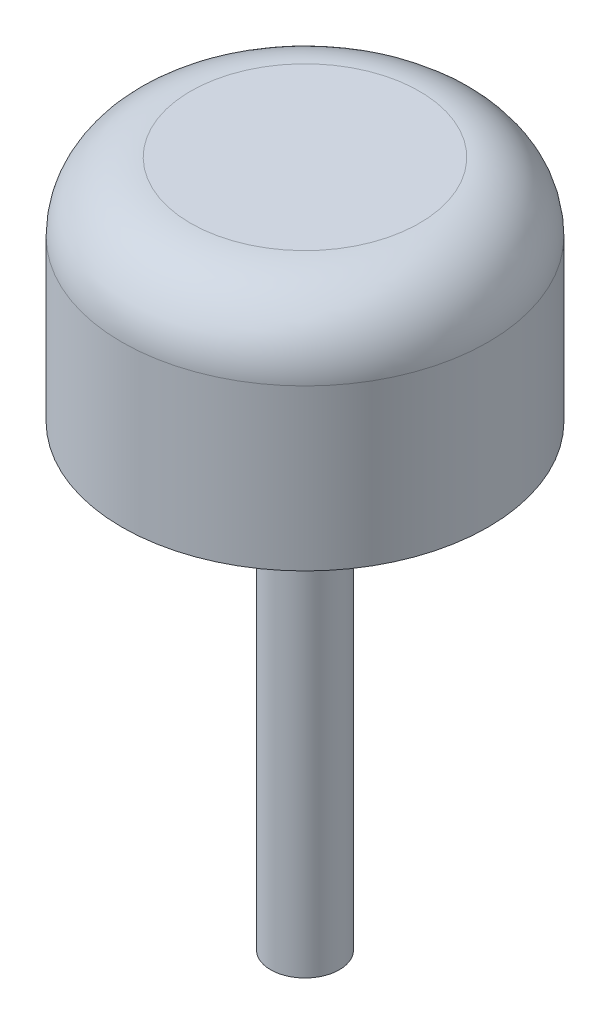
ISO-10303-21;
HEADER;
FILE_DESCRIPTION(('STEP AP214'),'2;1');
FILE_NAME('part.step','',(''),(''),'','','');
FILE_SCHEMA(('AUTOMOTIVE_DESIGN { 1 0 10303 214 1 1 1 1 }'));
ENDSEC;
DATA;
#1=APPLICATION_CONTEXT('core data for automotive mechanical design processes');
#2=APPLICATION_PROTOCOL_DEFINITION('international standard','automotive_design',2000,#1);
#3=PRODUCT_CONTEXT('',#1,'mechanical');
#4=PRODUCT('Part','Part','',(#3));
#5=PRODUCT_RELATED_PRODUCT_CATEGORY('part','',(#4));
#6=PRODUCT_DEFINITION_FORMATION('','',#4);
#7=PRODUCT_DEFINITION_CONTEXT('part definition',#1,'design');
#8=PRODUCT_DEFINITION('design','',#6,#7);
#9=PRODUCT_DEFINITION_SHAPE('','',#8);
#10=(LENGTH_UNIT() NAMED_UNIT(*) SI_UNIT(.MILLI.,.METRE.));
#11=(NAMED_UNIT(*) PLANE_ANGLE_UNIT() SI_UNIT($,.RADIAN.));
#12=(NAMED_UNIT(*) SI_UNIT($,.STERADIAN.) SOLID_ANGLE_UNIT());
#13=UNCERTAINTY_MEASURE_WITH_UNIT(LENGTH_MEASURE(1.E-05),#10,'distance_accuracy_value','');
#14=(GEOMETRIC_REPRESENTATION_CONTEXT(3) GLOBAL_UNCERTAINTY_ASSIGNED_CONTEXT((#13)) GLOBAL_UNIT_ASSIGNED_CONTEXT((#10,
#11,#12)) REPRESENTATION_CONTEXT('',''));
#15=CARTESIAN_POINT('',(0.,0.,0.));
#16=DIRECTION('',(0.,0.,1.));
#17=DIRECTION('',(1.,0.,0.));
#18=AXIS2_PLACEMENT_3D('',#15,#16,#17);
#19=CARTESIAN_POINT('',(0.,0.,0.));
#20=DIRECTION('',(0.,1.,0.));
#21=DIRECTION('',(0.,0.,1.));
#22=AXIS2_PLACEMENT_3D('',#19,#20,#21);
#23=PLANE('',#22);
#24=CARTESIAN_POINT('',(0.,0.,0.));
#25=DIRECTION('',(0.,1.,0.));
#26=DIRECTION('',(0.,0.,1.));
#27=AXIS2_PLACEMENT_3D('',#24,#25,#26);
#28=CIRCLE('',#27,8.);
#29=CARTESIAN_POINT('',(0.,0.,8.));
#30=VERTEX_POINT('',#29);
#31=EDGE_CURVE('E47',#30,#30,#28,.T.);
#32=ORIENTED_EDGE('',*,*,#31,.F.);
#33=EDGE_LOOP('',(#32));
#34=FACE_BOUND('',#33,.T.);
#35=CARTESIAN_POINT('',(0.,0.,0.));
#36=DIRECTION('',(0.,1.,0.));
#37=DIRECTION('',(0.,0.,1.));
#38=AXIS2_PLACEMENT_3D('',#35,#36,#37);
#39=CIRCLE('',#38,1.5);
#40=CARTESIAN_POINT('',(0.,0.,1.5));
#41=VERTEX_POINT('',#40);
#42=EDGE_CURVE('E43',#41,#41,#39,.F.);
#43=ORIENTED_EDGE('',*,*,#42,.F.);
#44=EDGE_LOOP('',(#43));
#45=FACE_BOUND('',#44,.T.);
#46=ADVANCED_FACE('F32',(#34,#45),#23,.F.);
#47=CARTESIAN_POINT('',(0.,10.,0.));
#48=DIRECTION('',(0.,-1.,0.));
#49=DIRECTION('',(0.,0.,-1.));
#50=AXIS2_PLACEMENT_3D('',#47,#48,#49);
#51=CYLINDRICAL_SURFACE('',#50,8.);
#52=CARTESIAN_POINT('',(0.,7.,0.));
#53=DIRECTION('',(0.,1.,0.));
#54=DIRECTION('',(0.,0.,1.));
#55=AXIS2_PLACEMENT_3D('',#52,#53,#54);
#56=CIRCLE('',#55,8.);
#57=CARTESIAN_POINT('',(0.,7.,8.));
#58=VERTEX_POINT('',#57);
#59=EDGE_CURVE('E10',#58,#58,#56,.F.);
#60=ORIENTED_EDGE('',*,*,#59,.T.);
#61=EDGE_LOOP('',(#60));
#62=FACE_BOUND('',#61,.T.);
#63=ORIENTED_EDGE('',*,*,#31,.T.);
#64=EDGE_LOOP('',(#63));
#65=FACE_BOUND('',#64,.T.);
#66=ADVANCED_FACE('F66',(#62,#65),#51,.T.);
#67=CARTESIAN_POINT('',(0.,10.,0.));
#68=DIRECTION('',(0.,1.,0.));
#69=DIRECTION('',(0.,0.,1.));
#70=AXIS2_PLACEMENT_3D('',#67,#68,#69);
#71=PLANE('',#70);
#72=CARTESIAN_POINT('',(0.,10.,0.));
#73=DIRECTION('',(0.,1.,0.));
#74=DIRECTION('',(0.,0.,1.));
#75=AXIS2_PLACEMENT_3D('',#72,#73,#74);
#76=CIRCLE('',#75,5.);
#77=CARTESIAN_POINT('',(0.,10.,5.));
#78=VERTEX_POINT('',#77);
#79=EDGE_CURVE('E39',#78,#78,#76,.T.);
#80=ORIENTED_EDGE('',*,*,#79,.T.);
#81=EDGE_LOOP('',(#80));
#82=FACE_BOUND('',#81,.T.);
#83=ADVANCED_FACE('F61',(#82),#71,.T.);
#84=CARTESIAN_POINT('',(0.,-20.,0.));
#85=DIRECTION('',(0.,1.,0.));
#86=DIRECTION('',(0.,0.,1.));
#87=AXIS2_PLACEMENT_3D('',#84,#85,#86);
#88=CYLINDRICAL_SURFACE('',#87,1.5);
#89=CARTESIAN_POINT('',(0.,-20.,0.));
#90=DIRECTION('',(0.,-1.,0.));
#91=DIRECTION('',(0.,0.,-1.));
#92=AXIS2_PLACEMENT_3D('',#89,#90,#91);
#93=CIRCLE('',#92,1.5);
#94=CARTESIAN_POINT('',(0.,-20.,-1.5));
#95=VERTEX_POINT('',#94);
#96=EDGE_CURVE('E52',#95,#95,#93,.T.);
#97=ORIENTED_EDGE('',*,*,#96,.F.);
#98=EDGE_LOOP('',(#97));
#99=FACE_BOUND('',#98,.T.);
#100=ORIENTED_EDGE('',*,*,#42,.T.);
#101=EDGE_LOOP('',(#100));
#102=FACE_BOUND('',#101,.T.);
#103=ADVANCED_FACE('F58',(#99,#102),#88,.T.);
#104=CARTESIAN_POINT('',(0.,-20.,0.));
#105=DIRECTION('',(0.,-1.,0.));
#106=DIRECTION('',(0.,0.,-1.));
#107=AXIS2_PLACEMENT_3D('',#104,#105,#106);
#108=PLANE('',#107);
#109=ORIENTED_EDGE('',*,*,#96,.T.);
#110=EDGE_LOOP('',(#109));
#111=FACE_BOUND('',#110,.T.);
#112=ADVANCED_FACE('F56',(#111),#108,.T.);
#113=CARTESIAN_POINT('',(0.,7.,0.));
#114=DIRECTION('',(0.,1.,0.));
#115=DIRECTION('',(0.,0.,1.));
#116=AXIS2_PLACEMENT_3D('',#113,#114,#115);
#117=TOROIDAL_SURFACE('',#116,5.,3.);
#118=ORIENTED_EDGE('',*,*,#59,.F.);
#119=EDGE_LOOP('',(#118));
#120=FACE_BOUND('',#119,.T.);
#121=ORIENTED_EDGE('',*,*,#79,.F.);
#122=EDGE_LOOP('',(#121));
#123=FACE_BOUND('',#122,.T.);
#124=ADVANCED_FACE('F34',(#120,#123),#117,.T.);
#125=CLOSED_SHELL('',(#46,#66,#83,#103,#112,#124));
#126=MANIFOLD_SOLID_BREP('B2',#125);
#127=ADVANCED_BREP_SHAPE_REPRESENTATION('',(#18,#126),#14);
#128=SHAPE_DEFINITION_REPRESENTATION(#9,#127);
ENDSEC;
END-ISO-10303-21;
